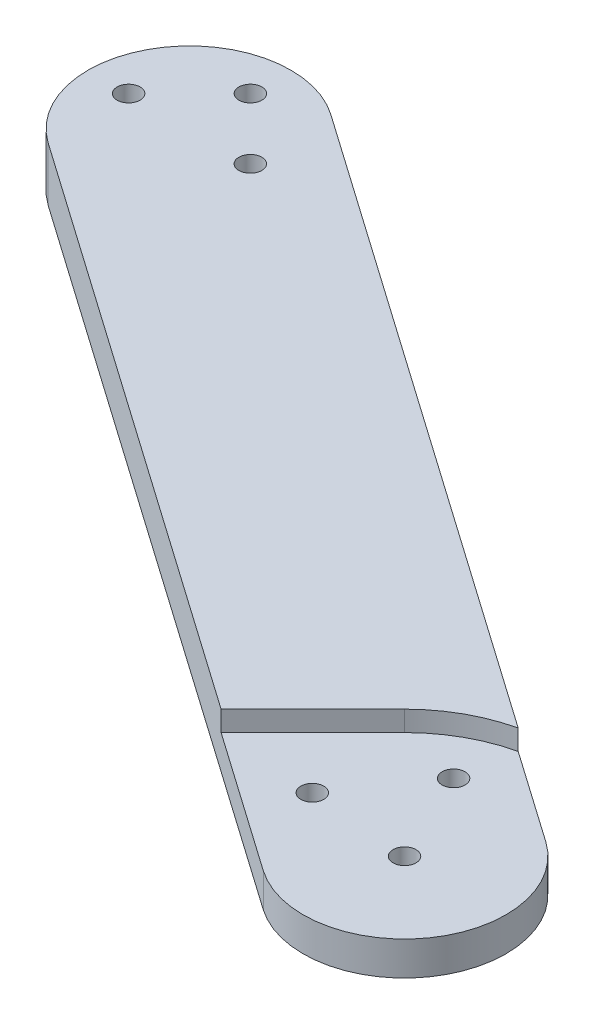
ISO-10303-21;
HEADER;
FILE_DESCRIPTION(('STEP AP214'),'2;1');
FILE_NAME('part.step','',(''),(''),'','','');
FILE_SCHEMA(('AUTOMOTIVE_DESIGN { 1 0 10303 214 1 1 1 1 }'));
ENDSEC;
DATA;
#1=APPLICATION_CONTEXT('core data for automotive mechanical design processes');
#2=APPLICATION_PROTOCOL_DEFINITION('international standard','automotive_design',2000,#1);
#3=PRODUCT_CONTEXT('',#1,'mechanical');
#4=PRODUCT('Part','Part','',(#3));
#5=PRODUCT_RELATED_PRODUCT_CATEGORY('part','',(#4));
#6=PRODUCT_DEFINITION_FORMATION('','',#4);
#7=PRODUCT_DEFINITION_CONTEXT('part definition',#1,'design');
#8=PRODUCT_DEFINITION('design','',#6,#7);
#9=PRODUCT_DEFINITION_SHAPE('','',#8);
#10=(LENGTH_UNIT() NAMED_UNIT(*) SI_UNIT(.MILLI.,.METRE.));
#11=(NAMED_UNIT(*) PLANE_ANGLE_UNIT() SI_UNIT($,.RADIAN.));
#12=(NAMED_UNIT(*) SI_UNIT($,.STERADIAN.) SOLID_ANGLE_UNIT());
#13=UNCERTAINTY_MEASURE_WITH_UNIT(LENGTH_MEASURE(1.E-05),#10,'distance_accuracy_value','');
#14=(GEOMETRIC_REPRESENTATION_CONTEXT(3) GLOBAL_UNCERTAINTY_ASSIGNED_CONTEXT((#13)) GLOBAL_UNIT_ASSIGNED_CONTEXT((#10,
#11,#12)) REPRESENTATION_CONTEXT('',''));
#15=CARTESIAN_POINT('',(0.,0.,0.));
#16=DIRECTION('',(0.,0.,1.));
#17=DIRECTION('',(1.,0.,0.));
#18=AXIS2_PLACEMENT_3D('',#15,#16,#17);
#19=CARTESIAN_POINT('',(114.669663723248,8.,-118.353297842317));
#20=DIRECTION('',(-0.573576436351041,0.,0.819152044288996));
#21=DIRECTION('',(0.819152044288996,0.,0.573576436351041));
#22=AXIS2_PLACEMENT_3D('',#19,#20,#21);
#23=PLANE('',#22);
#24=DIRECTION('',(0.,-1.,0.));
#25=VECTOR('',#24,1.);
#26=CARTESIAN_POINT('',(33.2924419680274,4.,-175.334241953885));
#27=LINE('',#26,#25);
#28=CARTESIAN_POINT('',(33.2924419680274,4.,-175.334241953885));
#29=VERTEX_POINT('',#28);
#30=CARTESIAN_POINT('',(33.2924419680273,0.,-175.334241953885));
#31=VERTEX_POINT('',#30);
#32=EDGE_CURVE('E57',#29,#31,#27,.T.);
#33=ORIENTED_EDGE('',*,*,#32,.F.);
#34=DIRECTION('',(-0.819152044288996,0.,-0.573576436351041));
#35=VECTOR('',#34,1.);
#36=CARTESIAN_POINT('',(93.3330247648083,4.,-133.293373281075));
#37=LINE('',#36,#35);
#38=CARTESIAN_POINT('',(8.6036465452656,4.,-192.62152261822));
#39=VERTEX_POINT('',#38);
#40=EDGE_CURVE('E118',#29,#39,#37,.T.);
#41=ORIENTED_EDGE('',*,*,#40,.T.);
#42=DIRECTION('',(0.,-1.,0.));
#43=VECTOR('',#42,1.);
#44=CARTESIAN_POINT('',(8.60364654526562,8.,-192.62152261822));
#45=LINE('',#44,#43);
#46=CARTESIAN_POINT('',(8.60364654526562,8.,-192.62152261822));
#47=VERTEX_POINT('',#46);
#48=EDGE_CURVE('E128',#47,#39,#45,.T.);
#49=ORIENTED_EDGE('',*,*,#48,.F.);
#50=DIRECTION('',(-0.819152044288996,0.,-0.573576436351041));
#51=VECTOR('',#50,1.);
#52=CARTESIAN_POINT('',(114.669663723248,8.,-118.353297842317));
#53=LINE('',#52,#51);
#54=CARTESIAN_POINT('',(101.042164046733,8.,-127.895375842763));
#55=VERTEX_POINT('',#54);
#56=EDGE_CURVE('E213',#55,#47,#53,.T.);
#57=ORIENTED_EDGE('',*,*,#56,.F.);
#58=DIRECTION('',(0.,1.,0.));
#59=VECTOR('',#58,1.);
#60=CARTESIAN_POINT('',(101.042164046733,5.,-127.895375842763));
#61=LINE('',#60,#59);
#62=CARTESIAN_POINT('',(101.042164046733,5.,-127.895375842763));
#63=VERTEX_POINT('',#62);
#64=EDGE_CURVE('E65',#55,#63,#61,.F.);
#65=ORIENTED_EDGE('',*,*,#64,.T.);
#66=DIRECTION('',(-0.819152044288996,0.,-0.573576436351041));
#67=VECTOR('',#66,1.);
#68=CARTESIAN_POINT('',(114.669663723248,5.,-118.353297842317));
#69=LINE('',#68,#67);
#70=CARTESIAN_POINT('',(114.669663723248,5.,-118.353297842317));
#71=VERTEX_POINT('',#70);
#72=EDGE_CURVE('E209',#71,#63,#69,.T.);
#73=ORIENTED_EDGE('',*,*,#72,.F.);
#74=DIRECTION('',(0.,-1.,0.));
#75=VECTOR('',#74,1.);
#76=CARTESIAN_POINT('',(114.669663723248,8.,-118.353297842317));
#77=LINE('',#76,#75);
#78=CARTESIAN_POINT('',(114.669663723248,0.,-118.353297842317));
#79=VERTEX_POINT('',#78);
#80=EDGE_CURVE('E139',#71,#79,#77,.T.);
#81=ORIENTED_EDGE('',*,*,#80,.T.);
#82=DIRECTION('',(-0.819152044288996,0.,-0.573576436351041));
#83=VECTOR('',#82,1.);
#84=CARTESIAN_POINT('',(114.669663723248,0.,-118.353297842317));
#85=LINE('',#84,#83);
#86=EDGE_CURVE('E225',#79,#31,#85,.T.);
#87=ORIENTED_EDGE('',*,*,#86,.T.);
#88=EDGE_LOOP('',(#33,#41,#49,#57,#65,#73,#81,#87));
#89=FACE_BOUND('',#88,.T.);
#90=ADVANCED_FACE('F39',(#89),#23,.F.);
#91=CARTESIAN_POINT('',(0.,8.,-180.334241953885));
#92=DIRECTION('',(0.,-1.,0.));
#93=DIRECTION('',(0.,0.,-1.));
#94=AXIS2_PLACEMENT_3D('',#91,#92,#93);
#95=CYLINDRICAL_SURFACE('',#94,15.);
#96=DIRECTION('',(0.,-1.,0.));
#97=VECTOR('',#96,1.);
#98=CARTESIAN_POINT('',(-14.1421356237309,4.,-175.334241953885));
#99=LINE('',#98,#97);
#100=CARTESIAN_POINT('',(-14.1421356237309,4.,-175.334241953885));
#101=VERTEX_POINT('',#100);
#102=CARTESIAN_POINT('',(-14.1421356237309,0.,-175.334241953885));
#103=VERTEX_POINT('',#102);
#104=EDGE_CURVE('E184',#101,#103,#99,.T.);
#105=ORIENTED_EDGE('',*,*,#104,.T.);
#106=CARTESIAN_POINT('',(0.,0.,-180.334241953885));
#107=DIRECTION('',(0.,1.,0.));
#108=DIRECTION('',(0.,0.,1.));
#109=AXIS2_PLACEMENT_3D('',#106,#107,#108);
#110=CIRCLE('',#109,15.);
#111=CARTESIAN_POINT('',(-8.60364654526561,0.,-168.04696128955));
#112=VERTEX_POINT('',#111);
#113=EDGE_CURVE('E228',#103,#112,#110,.T.);
#114=ORIENTED_EDGE('',*,*,#113,.T.);
#115=DIRECTION('',(0.,-1.,0.));
#116=VECTOR('',#115,1.);
#117=CARTESIAN_POINT('',(-8.60364654526561,8.,-168.04696128955));
#118=LINE('',#117,#116);
#119=CARTESIAN_POINT('',(-8.60364654526561,8.,-168.04696128955));
#120=VERTEX_POINT('',#119);
#121=EDGE_CURVE('E140',#120,#112,#118,.T.);
#122=ORIENTED_EDGE('',*,*,#121,.F.);
#123=CARTESIAN_POINT('',(0.,8.,-180.334241953885));
#124=DIRECTION('',(0.,1.,0.));
#125=DIRECTION('',(0.,0.,1.));
#126=AXIS2_PLACEMENT_3D('',#123,#124,#125);
#127=CIRCLE('',#126,15.);
#128=EDGE_CURVE('E137',#47,#120,#127,.T.);
#129=ORIENTED_EDGE('',*,*,#128,.F.);
#130=ORIENTED_EDGE('',*,*,#48,.T.);
#131=CARTESIAN_POINT('',(0.,4.,-180.334241953885));
#132=DIRECTION('',(0.,1.,0.));
#133=DIRECTION('',(0.,0.,1.));
#134=AXIS2_PLACEMENT_3D('',#131,#132,#133);
#135=CIRCLE('',#134,15.);
#136=EDGE_CURVE('E115',#39,#101,#135,.T.);
#137=ORIENTED_EDGE('',*,*,#136,.T.);
#138=EDGE_LOOP('',(#105,#114,#122,#129,#130,#137));
#139=FACE_BOUND('',#138,.T.);
#140=ADVANCED_FACE('F134',(#139),#95,.T.);
#141=CARTESIAN_POINT('',(106.066017177982,0.,-106.066017177982));
#142=DIRECTION('',(0.,1.,0.));
#143=DIRECTION('',(0.,0.,1.));
#144=AXIS2_PLACEMENT_3D('',#141,#142,#143);
#145=PLANE('',#144);
#146=CARTESIAN_POINT('',(99.7188638748578,0.,-119.666151182713));
#147=DIRECTION('',(0.,1.,0.));
#148=DIRECTION('',(0.,0.,1.));
#149=AXIS2_PLACEMENT_3D('',#146,#147,#148);
#150=CIRCLE('',#149,1.7);
#151=CARTESIAN_POINT('',(99.7188638748578,0.,-117.966151182713));
#152=VERTEX_POINT('',#151);
#153=EDGE_CURVE('E174',#152,#152,#150,.F.);
#154=ORIENTED_EDGE('',*,*,#153,.F.);
#155=EDGE_LOOP('',(#154));
#156=FACE_BOUND('',#155,.T.);
#157=CARTESIAN_POINT('',(91.1152173295922,0.,-107.378870518378));
#158=DIRECTION('',(0.,1.,0.));
#159=DIRECTION('',(0.,0.,1.));
#160=AXIS2_PLACEMENT_3D('',#157,#158,#159);
#161=CIRCLE('',#160,1.7);
#162=CARTESIAN_POINT('',(91.1152173295922,0.,-105.678870518378));
#163=VERTEX_POINT('',#162);
#164=EDGE_CURVE('E160',#163,#163,#161,.F.);
#165=ORIENTED_EDGE('',*,*,#164,.F.);
#166=EDGE_LOOP('',(#165));
#167=FACE_BOUND('',#166,.T.);
#168=CARTESIAN_POINT('',(106.066017177982,0.,-106.066017177982));
#169=DIRECTION('',(0.,1.,0.));
#170=DIRECTION('',(0.,0.,1.));
#171=AXIS2_PLACEMENT_3D('',#168,#169,#170);
#172=CIRCLE('',#171,1.7);
#173=CARTESIAN_POINT('',(106.066017177982,0.,-104.366017177982));
#174=VERTEX_POINT('',#173);
#175=EDGE_CURVE('E155',#174,#174,#172,.F.);
#176=ORIENTED_EDGE('',*,*,#175,.F.);
#177=EDGE_LOOP('',(#176));
#178=FACE_BOUND('',#177,.T.);
#179=DIRECTION('',(1.,0.,0.));
#180=VECTOR('',#179,1.);
#181=CARTESIAN_POINT('',(0.,0.,-175.334241953885));
#182=LINE('',#181,#180);
#183=EDGE_CURVE('E132',#103,#31,#182,.T.);
#184=ORIENTED_EDGE('',*,*,#183,.T.);
#185=ORIENTED_EDGE('',*,*,#86,.F.);
#186=CARTESIAN_POINT('',(106.066017177982,0.,-106.066017177982));
#187=DIRECTION('',(0.,1.,0.));
#188=DIRECTION('',(0.,0.,1.));
#189=AXIS2_PLACEMENT_3D('',#186,#187,#188);
#190=CIRCLE('',#189,15.);
#191=CARTESIAN_POINT('',(97.4623706327163,0.,-93.7787365136474));
#192=VERTEX_POINT('',#191);
#193=EDGE_CURVE('E212',#192,#79,#190,.T.);
#194=ORIENTED_EDGE('',*,*,#193,.F.);
#195=DIRECTION('',(-0.819152044288995,0.,-0.573576436351041));
#196=VECTOR('',#195,1.);
#197=CARTESIAN_POINT('',(97.4623706327163,0.,-93.7787365136474));
#198=LINE('',#197,#196);
#199=EDGE_CURVE('E216',#192,#112,#198,.T.);
#200=ORIENTED_EDGE('',*,*,#199,.T.);
#201=ORIENTED_EDGE('',*,*,#113,.F.);
#202=EDGE_LOOP('',(#184,#185,#194,#200,#201));
#203=FACE_BOUND('',#202,.T.);
#204=ADVANCED_FACE('F243',(#156,#167,#178,#203),#145,.F.);
#205=CARTESIAN_POINT('',(106.066017177982,8.,-106.066017177982));
#206=DIRECTION('',(0.,-1.,0.));
#207=DIRECTION('',(0.,0.,-1.));
#208=AXIS2_PLACEMENT_3D('',#205,#206,#207);
#209=CYLINDRICAL_SURFACE('',#208,15.);
#210=CARTESIAN_POINT('',(106.066017177982,5.,-106.066017177982));
#211=DIRECTION('',(0.,1.,0.));
#212=DIRECTION('',(0.,0.,1.));
#213=AXIS2_PLACEMENT_3D('',#210,#211,#212);
#214=CIRCLE('',#213,15.);
#215=CARTESIAN_POINT('',(97.4623706327163,5.,-93.7787365136474));
#216=VERTEX_POINT('',#215);
#217=EDGE_CURVE('E206',#216,#71,#214,.T.);
#218=ORIENTED_EDGE('',*,*,#217,.F.);
#219=DIRECTION('',(0.,-1.,0.));
#220=VECTOR('',#219,1.);
#221=CARTESIAN_POINT('',(97.4623706327163,8.,-93.7787365136474));
#222=LINE('',#221,#220);
#223=EDGE_CURVE('E146',#216,#192,#222,.T.);
#224=ORIENTED_EDGE('',*,*,#223,.T.);
#225=ORIENTED_EDGE('',*,*,#193,.T.);
#226=ORIENTED_EDGE('',*,*,#80,.F.);
#227=EDGE_LOOP('',(#218,#224,#225,#226));
#228=FACE_BOUND('',#227,.T.);
#229=ADVANCED_FACE('F41',(#228),#209,.T.);
#230=CARTESIAN_POINT('',(97.4623706327163,8.,-93.7787365136474));
#231=DIRECTION('',(-0.573576436351041,0.,0.819152044288995));
#232=DIRECTION('',(0.819152044288995,0.,0.573576436351041));
#233=AXIS2_PLACEMENT_3D('',#230,#231,#232);
#234=PLANE('',#233);
#235=DIRECTION('',(0.,-1.,0.));
#236=VECTOR('',#235,1.);
#237=CARTESIAN_POINT('',(76.6637227491397,8.,-108.342106546297));
#238=LINE('',#237,#236);
#239=CARTESIAN_POINT('',(76.6637227491397,8.,-108.342106546297));
#240=VERTEX_POINT('',#239);
#241=CARTESIAN_POINT('',(76.6637227491397,5.,-108.342106546297));
#242=VERTEX_POINT('',#241);
#243=EDGE_CURVE('E203',#240,#242,#238,.T.);
#244=ORIENTED_EDGE('',*,*,#243,.F.);
#245=DIRECTION('',(-0.819152044288995,0.,-0.573576436351041));
#246=VECTOR('',#245,1.);
#247=CARTESIAN_POINT('',(97.4623706327163,8.,-93.7787365136474));
#248=LINE('',#247,#246);
#249=EDGE_CURVE('E219',#240,#120,#248,.T.);
#250=ORIENTED_EDGE('',*,*,#249,.T.);
#251=ORIENTED_EDGE('',*,*,#121,.T.);
#252=ORIENTED_EDGE('',*,*,#199,.F.);
#253=ORIENTED_EDGE('',*,*,#223,.F.);
#254=DIRECTION('',(-0.819152044288995,0.,-0.573576436351041));
#255=VECTOR('',#254,1.);
#256=CARTESIAN_POINT('',(97.4623706327163,5.,-93.7787365136474));
#257=LINE('',#256,#255);
#258=EDGE_CURVE('E11',#216,#242,#257,.T.);
#259=ORIENTED_EDGE('',*,*,#258,.T.);
#260=EDGE_LOOP('',(#244,#250,#251,#252,#253,#259));
#261=FACE_BOUND('',#260,.T.);
#262=ADVANCED_FACE('F246',(#261),#234,.T.);
#263=CARTESIAN_POINT('',(106.066017177982,8.,-106.066017177982));
#264=DIRECTION('',(0.,1.,0.));
#265=DIRECTION('',(0.,0.,1.));
#266=AXIS2_PLACEMENT_3D('',#263,#264,#265);
#267=PLANE('',#266);
#268=CARTESIAN_POINT('',(0.,8.,-189.334241953885));
#269=DIRECTION('',(0.,1.,0.));
#270=DIRECTION('',(0.,0.,1.));
#271=AXIS2_PLACEMENT_3D('',#268,#269,#270);
#272=CIRCLE('',#271,1.7);
#273=CARTESIAN_POINT('',(0.,8.,-187.634241953885));
#274=VERTEX_POINT('',#273);
#275=EDGE_CURVE('E419',#274,#274,#272,.T.);
#276=ORIENTED_EDGE('',*,*,#275,.F.);
#277=EDGE_LOOP('',(#276));
#278=FACE_BOUND('',#277,.T.);
#279=CARTESIAN_POINT('',(-9.,8.,-180.334241953885));
#280=DIRECTION('',(0.,1.,0.));
#281=DIRECTION('',(0.,0.,1.));
#282=AXIS2_PLACEMENT_3D('',#279,#280,#281);
#283=CIRCLE('',#282,1.7);
#284=CARTESIAN_POINT('',(-9.,8.,-178.634241953885));
#285=VERTEX_POINT('',#284);
#286=EDGE_CURVE('E430',#285,#285,#283,.T.);
#287=ORIENTED_EDGE('',*,*,#286,.F.);
#288=EDGE_LOOP('',(#287));
#289=FACE_BOUND('',#288,.T.);
#290=CARTESIAN_POINT('',(9.,8.,-180.334241953885));
#291=DIRECTION('',(0.,1.,0.));
#292=DIRECTION('',(0.,0.,1.));
#293=AXIS2_PLACEMENT_3D('',#290,#291,#292);
#294=CIRCLE('',#293,1.7);
#295=CARTESIAN_POINT('',(9.,8.,-178.634241953885));
#296=VERTEX_POINT('',#295);
#297=EDGE_CURVE('E433',#296,#296,#294,.T.);
#298=ORIENTED_EDGE('',*,*,#297,.F.);
#299=EDGE_LOOP('',(#298));
#300=FACE_BOUND('',#299,.T.);
#301=DIRECTION('',(-0.707106781186548,0.,0.707106781186547));
#302=VECTOR('',#301,1.);
#303=CARTESIAN_POINT('',(90.2268252794035,8.,-121.905209076561));
#304=LINE('',#303,#302);
#305=CARTESIAN_POINT('',(90.2268252794033,8.,-121.905209076561));
#306=VERTEX_POINT('',#305);
#307=EDGE_CURVE('E187',#306,#240,#304,.T.);
#308=ORIENTED_EDGE('',*,*,#307,.F.);
#309=CARTESIAN_POINT('',(106.066017177982,8.,-106.066017177982));
#310=DIRECTION('',(0.,1.,0.));
#311=DIRECTION('',(0.,0.,1.));
#312=AXIS2_PLACEMENT_3D('',#309,#310,#311);
#313=CIRCLE('',#312,22.3999999999999);
#314=EDGE_CURVE('E49',#55,#306,#313,.T.);
#315=ORIENTED_EDGE('',*,*,#314,.F.);
#316=ORIENTED_EDGE('',*,*,#56,.T.);
#317=ORIENTED_EDGE('',*,*,#128,.T.);
#318=ORIENTED_EDGE('',*,*,#249,.F.);
#319=EDGE_LOOP('',(#308,#315,#316,#317,#318));
#320=FACE_BOUND('',#319,.T.);
#321=ADVANCED_FACE('F258',(#278,#289,#300,#320),#267,.T.);
#322=CARTESIAN_POINT('',(0.,5.,0.));
#323=DIRECTION('',(0.,1.,0.));
#324=DIRECTION('',(0.,0.,1.));
#325=AXIS2_PLACEMENT_3D('',#322,#323,#324);
#326=PLANE('',#325);
#327=CARTESIAN_POINT('',(99.7188638748578,5.,-119.666151182713));
#328=DIRECTION('',(0.,1.,0.));
#329=DIRECTION('',(0.,0.,1.));
#330=AXIS2_PLACEMENT_3D('',#327,#328,#329);
#331=CIRCLE('',#330,1.7);
#332=CARTESIAN_POINT('',(99.7188638748578,5.,-117.966151182713));
#333=VERTEX_POINT('',#332);
#334=EDGE_CURVE('E43',#333,#333,#331,.F.);
#335=ORIENTED_EDGE('',*,*,#334,.T.);
#336=EDGE_LOOP('',(#335));
#337=FACE_BOUND('',#336,.T.);
#338=CARTESIAN_POINT('',(91.1152173295922,5.,-107.378870518378));
#339=DIRECTION('',(0.,1.,0.));
#340=DIRECTION('',(0.,0.,1.));
#341=AXIS2_PLACEMENT_3D('',#338,#339,#340);
#342=CIRCLE('',#341,1.7);
#343=CARTESIAN_POINT('',(91.1152173295922,5.,-105.678870518378));
#344=VERTEX_POINT('',#343);
#345=EDGE_CURVE('E157',#344,#344,#342,.F.);
#346=ORIENTED_EDGE('',*,*,#345,.T.);
#347=EDGE_LOOP('',(#346));
#348=FACE_BOUND('',#347,.T.);
#349=CARTESIAN_POINT('',(106.066017177982,5.,-106.066017177982));
#350=DIRECTION('',(0.,1.,0.));
#351=DIRECTION('',(0.,0.,1.));
#352=AXIS2_PLACEMENT_3D('',#349,#350,#351);
#353=CIRCLE('',#352,1.7);
#354=CARTESIAN_POINT('',(106.066017177982,5.,-104.366017177982));
#355=VERTEX_POINT('',#354);
#356=EDGE_CURVE('E152',#355,#355,#353,.F.);
#357=ORIENTED_EDGE('',*,*,#356,.T.);
#358=EDGE_LOOP('',(#357));
#359=FACE_BOUND('',#358,.T.);
#360=ORIENTED_EDGE('',*,*,#72,.T.);
#361=CARTESIAN_POINT('',(106.066017177982,5.,-106.066017177982));
#362=DIRECTION('',(0.,1.,0.));
#363=DIRECTION('',(0.,0.,1.));
#364=AXIS2_PLACEMENT_3D('',#361,#362,#363);
#365=CIRCLE('',#364,22.3999999999999);
#366=CARTESIAN_POINT('',(90.2268252794033,5.,-121.905209076561));
#367=VERTEX_POINT('',#366);
#368=EDGE_CURVE('E188',#63,#367,#365,.T.);
#369=ORIENTED_EDGE('',*,*,#368,.T.);
#370=DIRECTION('',(-0.707106781186548,0.,0.707106781186547));
#371=VECTOR('',#370,1.);
#372=CARTESIAN_POINT('',(90.2268252794035,5.,-121.905209076561));
#373=LINE('',#372,#371);
#374=EDGE_CURVE('E191',#367,#242,#373,.T.);
#375=ORIENTED_EDGE('',*,*,#374,.T.);
#376=ORIENTED_EDGE('',*,*,#258,.F.);
#377=ORIENTED_EDGE('',*,*,#217,.T.);
#378=EDGE_LOOP('',(#360,#369,#375,#376,#377));
#379=FACE_BOUND('',#378,.T.);
#380=ADVANCED_FACE('F250',(#337,#348,#359,#379),#326,.T.);
#381=CARTESIAN_POINT('',(106.066017177982,5.,-106.066017177982));
#382=DIRECTION('',(0.,1.,0.));
#383=DIRECTION('',(0.,0.,1.));
#384=AXIS2_PLACEMENT_3D('',#381,#382,#383);
#385=CYLINDRICAL_SURFACE('',#384,22.3999999999999);
#386=ORIENTED_EDGE('',*,*,#314,.T.);
#387=DIRECTION('',(0.,1.,0.));
#388=VECTOR('',#387,1.);
#389=CARTESIAN_POINT('',(90.2268252794033,5.,-121.905209076561));
#390=LINE('',#389,#388);
#391=EDGE_CURVE('E195',#367,#306,#390,.T.);
#392=ORIENTED_EDGE('',*,*,#391,.F.);
#393=ORIENTED_EDGE('',*,*,#368,.F.);
#394=ORIENTED_EDGE('',*,*,#64,.F.);
#395=EDGE_LOOP('',(#386,#392,#393,#394));
#396=FACE_BOUND('',#395,.T.);
#397=ADVANCED_FACE('F252',(#396),#385,.F.);
#398=CARTESIAN_POINT('',(90.2268252794035,5.,-121.905209076561));
#399=DIRECTION('',(-0.707106781186547,0.,-0.707106781186548));
#400=DIRECTION('',(-0.707106781186548,0.,0.707106781186547));
#401=AXIS2_PLACEMENT_3D('',#398,#399,#400);
#402=PLANE('',#401);
#403=ORIENTED_EDGE('',*,*,#243,.T.);
#404=ORIENTED_EDGE('',*,*,#374,.F.);
#405=ORIENTED_EDGE('',*,*,#391,.T.);
#406=ORIENTED_EDGE('',*,*,#307,.T.);
#407=EDGE_LOOP('',(#403,#404,#405,#406));
#408=FACE_BOUND('',#407,.T.);
#409=ADVANCED_FACE('F256',(#408),#402,.F.);
#410=CARTESIAN_POINT('',(0.,4.,-175.334241953885));
#411=DIRECTION('',(0.,0.,-1.));
#412=DIRECTION('',(-1.,0.,0.));
#413=AXIS2_PLACEMENT_3D('',#410,#411,#412);
#414=PLANE('',#413);
#415=ORIENTED_EDGE('',*,*,#183,.F.);
#416=ORIENTED_EDGE('',*,*,#104,.F.);
#417=DIRECTION('',(1.,0.,0.));
#418=VECTOR('',#417,1.);
#419=CARTESIAN_POINT('',(0.,4.,-175.334241953885));
#420=LINE('',#419,#418);
#421=EDGE_CURVE('E119',#101,#29,#420,.T.);
#422=ORIENTED_EDGE('',*,*,#421,.T.);
#423=ORIENTED_EDGE('',*,*,#32,.T.);
#424=EDGE_LOOP('',(#415,#416,#422,#423));
#425=FACE_BOUND('',#424,.T.);
#426=ADVANCED_FACE('F308',(#425),#414,.T.);
#427=CARTESIAN_POINT('',(0.,4.,0.));
#428=DIRECTION('',(0.,1.,0.));
#429=DIRECTION('',(0.,0.,1.));
#430=AXIS2_PLACEMENT_3D('',#427,#428,#429);
#431=PLANE('',#430);
#432=CARTESIAN_POINT('',(-9.,4.,-180.334241953885));
#433=DIRECTION('',(0.,1.,0.));
#434=DIRECTION('',(0.,0.,1.));
#435=AXIS2_PLACEMENT_3D('',#432,#433,#434);
#436=CIRCLE('',#435,1.7);
#437=CARTESIAN_POINT('',(-9.,4.,-178.634241953885));
#438=VERTEX_POINT('',#437);
#439=EDGE_CURVE('E156',#438,#438,#436,.F.);
#440=ORIENTED_EDGE('',*,*,#439,.F.);
#441=EDGE_LOOP('',(#440));
#442=FACE_BOUND('',#441,.T.);
#443=CARTESIAN_POINT('',(9.,4.,-180.334241953885));
#444=DIRECTION('',(0.,1.,0.));
#445=DIRECTION('',(0.,0.,1.));
#446=AXIS2_PLACEMENT_3D('',#443,#444,#445);
#447=CIRCLE('',#446,1.7);
#448=CARTESIAN_POINT('',(9.,4.,-178.634241953885));
#449=VERTEX_POINT('',#448);
#450=EDGE_CURVE('E425',#449,#449,#447,.F.);
#451=ORIENTED_EDGE('',*,*,#450,.F.);
#452=EDGE_LOOP('',(#451));
#453=FACE_BOUND('',#452,.T.);
#454=CARTESIAN_POINT('',(0.,4.,-189.334241953885));
#455=DIRECTION('',(0.,1.,0.));
#456=DIRECTION('',(0.,0.,1.));
#457=AXIS2_PLACEMENT_3D('',#454,#455,#456);
#458=CIRCLE('',#457,1.7);
#459=CARTESIAN_POINT('',(0.,4.,-187.634241953885));
#460=VERTEX_POINT('',#459);
#461=EDGE_CURVE('E422',#460,#460,#458,.F.);
#462=ORIENTED_EDGE('',*,*,#461,.F.);
#463=EDGE_LOOP('',(#462));
#464=FACE_BOUND('',#463,.T.);
#465=ORIENTED_EDGE('',*,*,#40,.F.);
#466=ORIENTED_EDGE('',*,*,#421,.F.);
#467=ORIENTED_EDGE('',*,*,#136,.F.);
#468=EDGE_LOOP('',(#465,#466,#467));
#469=FACE_BOUND('',#468,.T.);
#470=ADVANCED_FACE('F117',(#442,#453,#464,#469),#431,.F.);
#471=CARTESIAN_POINT('',(9.,8.,-180.334241953885));
#472=DIRECTION('',(0.,-1.,0.));
#473=DIRECTION('',(0.,0.,-1.));
#474=AXIS2_PLACEMENT_3D('',#471,#472,#473);
#475=CYLINDRICAL_SURFACE('',#474,1.7);
#476=ORIENTED_EDGE('',*,*,#297,.T.);
#477=EDGE_LOOP('',(#476));
#478=FACE_BOUND('',#477,.T.);
#479=ORIENTED_EDGE('',*,*,#450,.T.);
#480=EDGE_LOOP('',(#479));
#481=FACE_BOUND('',#480,.T.);
#482=ADVANCED_FACE('F307',(#478,#481),#475,.F.);
#483=CARTESIAN_POINT('',(-9.,8.,-180.334241953885));
#484=DIRECTION('',(0.,-1.,0.));
#485=DIRECTION('',(0.,0.,-1.));
#486=AXIS2_PLACEMENT_3D('',#483,#484,#485);
#487=CYLINDRICAL_SURFACE('',#486,1.7);
#488=ORIENTED_EDGE('',*,*,#286,.T.);
#489=EDGE_LOOP('',(#488));
#490=FACE_BOUND('',#489,.T.);
#491=ORIENTED_EDGE('',*,*,#439,.T.);
#492=EDGE_LOOP('',(#491));
#493=FACE_BOUND('',#492,.T.);
#494=ADVANCED_FACE('F338',(#490,#493),#487,.F.);
#495=CARTESIAN_POINT('',(0.,8.,-189.334241953885));
#496=DIRECTION('',(0.,-1.,0.));
#497=DIRECTION('',(0.,0.,-1.));
#498=AXIS2_PLACEMENT_3D('',#495,#496,#497);
#499=CYLINDRICAL_SURFACE('',#498,1.7);
#500=ORIENTED_EDGE('',*,*,#275,.T.);
#501=EDGE_LOOP('',(#500));
#502=FACE_BOUND('',#501,.T.);
#503=ORIENTED_EDGE('',*,*,#461,.T.);
#504=EDGE_LOOP('',(#503));
#505=FACE_BOUND('',#504,.T.);
#506=ADVANCED_FACE('F300',(#502,#505),#499,.F.);
#507=CARTESIAN_POINT('',(106.066017177982,8.,-106.066017177982));
#508=DIRECTION('',(0.,-1.,0.));
#509=DIRECTION('',(0.,0.,-1.));
#510=AXIS2_PLACEMENT_3D('',#507,#508,#509);
#511=CYLINDRICAL_SURFACE('',#510,1.7);
#512=ORIENTED_EDGE('',*,*,#356,.F.);
#513=EDGE_LOOP('',(#512));
#514=FACE_BOUND('',#513,.T.);
#515=ORIENTED_EDGE('',*,*,#175,.T.);
#516=EDGE_LOOP('',(#515));
#517=FACE_BOUND('',#516,.T.);
#518=ADVANCED_FACE('F291',(#514,#517),#511,.F.);
#519=CARTESIAN_POINT('',(91.1152173295922,8.,-107.378870518378));
#520=DIRECTION('',(0.,-1.,0.));
#521=DIRECTION('',(0.,0.,-1.));
#522=AXIS2_PLACEMENT_3D('',#519,#520,#521);
#523=CYLINDRICAL_SURFACE('',#522,1.7);
#524=ORIENTED_EDGE('',*,*,#345,.F.);
#525=EDGE_LOOP('',(#524));
#526=FACE_BOUND('',#525,.T.);
#527=ORIENTED_EDGE('',*,*,#164,.T.);
#528=EDGE_LOOP('',(#527));
#529=FACE_BOUND('',#528,.T.);
#530=ADVANCED_FACE('F288',(#526,#529),#523,.F.);
#531=CARTESIAN_POINT('',(99.7188638748578,8.,-119.666151182713));
#532=DIRECTION('',(0.,-1.,0.));
#533=DIRECTION('',(0.,0.,-1.));
#534=AXIS2_PLACEMENT_3D('',#531,#532,#533);
#535=CYLINDRICAL_SURFACE('',#534,1.7);
#536=ORIENTED_EDGE('',*,*,#334,.F.);
#537=EDGE_LOOP('',(#536));
#538=FACE_BOUND('',#537,.T.);
#539=ORIENTED_EDGE('',*,*,#153,.T.);
#540=EDGE_LOOP('',(#539));
#541=FACE_BOUND('',#540,.T.);
#542=ADVANCED_FACE('F290',(#538,#541),#535,.F.);
#543=CLOSED_SHELL('',(#90,#140,#204,#229,#262,#321,#380,#397,#409,#426,#470,#482,#494,#506,#518,
#530,#542));
#544=MANIFOLD_SOLID_BREP('B2',#543);
#545=ADVANCED_BREP_SHAPE_REPRESENTATION('',(#18,#544),#14);
#546=SHAPE_DEFINITION_REPRESENTATION(#9,#545);
ENDSEC;
END-ISO-10303-21;
